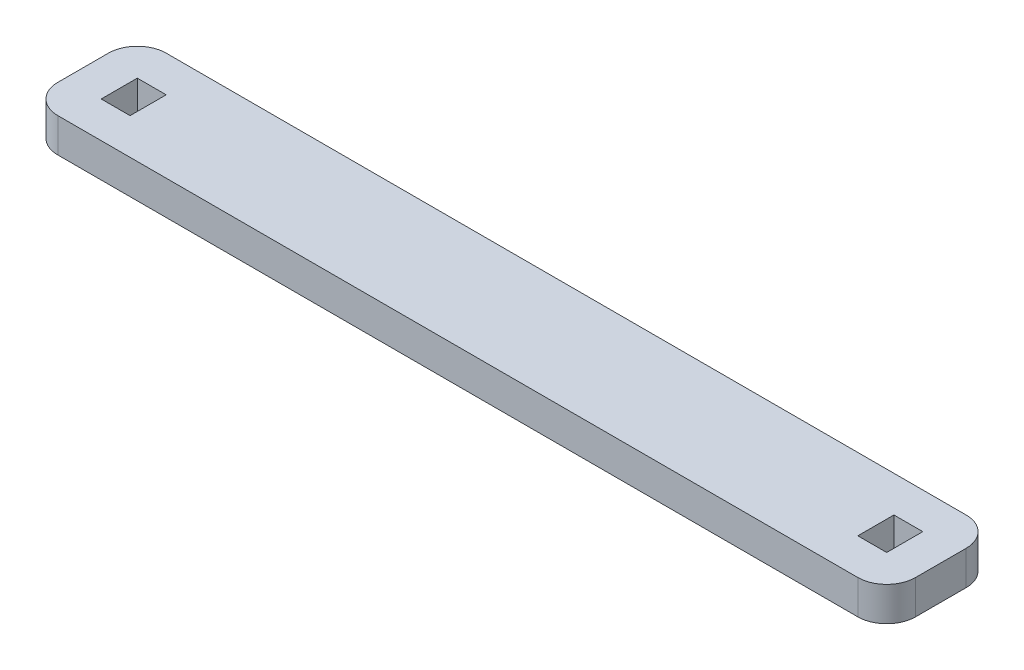
ISO-10303-21;
HEADER;
FILE_DESCRIPTION(('STEP AP214'),'2;1');
FILE_NAME('part.step','',(''),(''),'','','');
FILE_SCHEMA(('AUTOMOTIVE_DESIGN { 1 0 10303 214 1 1 1 1 }'));
ENDSEC;
DATA;
#1=APPLICATION_CONTEXT('core data for automotive mechanical design processes');
#2=APPLICATION_PROTOCOL_DEFINITION('international standard','automotive_design',2000,#1);
#3=PRODUCT_CONTEXT('',#1,'mechanical');
#4=PRODUCT('Part','Part','',(#3));
#5=PRODUCT_RELATED_PRODUCT_CATEGORY('part','',(#4));
#6=PRODUCT_DEFINITION_FORMATION('','',#4);
#7=PRODUCT_DEFINITION_CONTEXT('part definition',#1,'design');
#8=PRODUCT_DEFINITION('design','',#6,#7);
#9=PRODUCT_DEFINITION_SHAPE('','',#8);
#10=(LENGTH_UNIT() NAMED_UNIT(*) SI_UNIT(.MILLI.,.METRE.));
#11=(NAMED_UNIT(*) PLANE_ANGLE_UNIT() SI_UNIT($,.RADIAN.));
#12=(NAMED_UNIT(*) SI_UNIT($,.STERADIAN.) SOLID_ANGLE_UNIT());
#13=UNCERTAINTY_MEASURE_WITH_UNIT(LENGTH_MEASURE(1.E-05),#10,'distance_accuracy_value','');
#14=(GEOMETRIC_REPRESENTATION_CONTEXT(3) GLOBAL_UNCERTAINTY_ASSIGNED_CONTEXT((#13)) GLOBAL_UNIT_ASSIGNED_CONTEXT((#10,
#11,#12)) REPRESENTATION_CONTEXT('',''));
#15=CARTESIAN_POINT('',(0.,0.,0.));
#16=DIRECTION('',(0.,0.,1.));
#17=DIRECTION('',(1.,0.,0.));
#18=AXIS2_PLACEMENT_3D('',#15,#16,#17);
#19=CARTESIAN_POINT('',(0.,1.5,0.));
#20=DIRECTION('',(0.,1.,0.));
#21=DIRECTION('',(0.,0.,1.));
#22=AXIS2_PLACEMENT_3D('',#19,#20,#21);
#23=PLANE('',#22);
#24=DIRECTION('',(-1.,0.,0.));
#25=VECTOR('',#24,1.);
#26=CARTESIAN_POINT('',(37.719,1.5,-4.7625));
#27=LINE('',#26,#25);
#28=CARTESIAN_POINT('',(35.179,1.5,-4.7625));
#29=VERTEX_POINT('',#28);
#30=CARTESIAN_POINT('',(-35.179,1.5,-4.7625));
#31=VERTEX_POINT('',#30);
#32=EDGE_CURVE('E268',#29,#31,#27,.T.);
#33=ORIENTED_EDGE('',*,*,#32,.T.);
#34=CARTESIAN_POINT('',(-35.179,1.5,-2.2225));
#35=DIRECTION('',(0.,1.,0.));
#36=DIRECTION('',(0.,0.,1.));
#37=AXIS2_PLACEMENT_3D('',#34,#35,#36);
#38=CIRCLE('',#37,2.54);
#39=CARTESIAN_POINT('',(-37.719,1.5,-2.2225));
#40=VERTEX_POINT('',#39);
#41=EDGE_CURVE('E319',#31,#40,#38,.T.);
#42=ORIENTED_EDGE('',*,*,#41,.T.);
#43=DIRECTION('',(0.,0.,1.));
#44=VECTOR('',#43,1.);
#45=CARTESIAN_POINT('',(-37.719,1.5,4.7625));
#46=LINE('',#45,#44);
#47=CARTESIAN_POINT('',(-37.719,1.5,2.2225));
#48=VERTEX_POINT('',#47);
#49=EDGE_CURVE('E257',#40,#48,#46,.T.);
#50=ORIENTED_EDGE('',*,*,#49,.T.);
#51=CARTESIAN_POINT('',(-35.179,1.5,2.2225));
#52=DIRECTION('',(0.,1.,0.));
#53=DIRECTION('',(0.,0.,1.));
#54=AXIS2_PLACEMENT_3D('',#51,#52,#53);
#55=CIRCLE('',#54,2.54);
#56=CARTESIAN_POINT('',(-35.179,1.5,4.7625));
#57=VERTEX_POINT('',#56);
#58=EDGE_CURVE('E311',#48,#57,#55,.T.);
#59=ORIENTED_EDGE('',*,*,#58,.T.);
#60=DIRECTION('',(1.,0.,0.));
#61=VECTOR('',#60,1.);
#62=CARTESIAN_POINT('',(37.719,1.5,4.7625));
#63=LINE('',#62,#61);
#64=CARTESIAN_POINT('',(35.179,1.5,4.7625));
#65=VERTEX_POINT('',#64);
#66=EDGE_CURVE('E261',#57,#65,#63,.T.);
#67=ORIENTED_EDGE('',*,*,#66,.T.);
#68=CARTESIAN_POINT('',(35.179,1.5,2.2225));
#69=DIRECTION('',(0.,1.,0.));
#70=DIRECTION('',(0.,0.,1.));
#71=AXIS2_PLACEMENT_3D('',#68,#69,#70);
#72=CIRCLE('',#71,2.54);
#73=CARTESIAN_POINT('',(37.719,1.5,2.2225));
#74=VERTEX_POINT('',#73);
#75=EDGE_CURVE('E68',#65,#74,#72,.T.);
#76=ORIENTED_EDGE('',*,*,#75,.T.);
#77=DIRECTION('',(0.,0.,-1.));
#78=VECTOR('',#77,1.);
#79=CARTESIAN_POINT('',(37.719,1.5,4.7625));
#80=LINE('',#79,#78);
#81=CARTESIAN_POINT('',(37.719,1.5,-2.2225));
#82=VERTEX_POINT('',#81);
#83=EDGE_CURVE('E265',#74,#82,#80,.T.);
#84=ORIENTED_EDGE('',*,*,#83,.T.);
#85=CARTESIAN_POINT('',(35.179,1.5,-2.2225));
#86=DIRECTION('',(0.,1.,0.));
#87=DIRECTION('',(0.,0.,1.));
#88=AXIS2_PLACEMENT_3D('',#85,#86,#87);
#89=CIRCLE('',#88,2.54);
#90=EDGE_CURVE('E316',#82,#29,#89,.T.);
#91=ORIENTED_EDGE('',*,*,#90,.T.);
#92=EDGE_LOOP('',(#33,#42,#50,#59,#67,#76,#84,#91));
#93=FACE_BOUND('',#92,.T.);
#94=DIRECTION('',(1.,0.,0.));
#95=VECTOR('',#94,1.);
#96=CARTESIAN_POINT('',(-32.004,1.5,1.5875));
#97=LINE('',#96,#95);
#98=CARTESIAN_POINT('',(-34.544,1.5,1.5875));
#99=VERTEX_POINT('',#98);
#100=CARTESIAN_POINT('',(-32.004,1.5,1.5875));
#101=VERTEX_POINT('',#100);
#102=EDGE_CURVE('E217',#99,#101,#97,.T.);
#103=ORIENTED_EDGE('',*,*,#102,.F.);
#104=DIRECTION('',(0.,0.,1.));
#105=VECTOR('',#104,1.);
#106=CARTESIAN_POINT('',(-34.544,1.5,1.5875));
#107=LINE('',#106,#105);
#108=CARTESIAN_POINT('',(-34.544,1.5,-1.5875));
#109=VERTEX_POINT('',#108);
#110=EDGE_CURVE('E214',#109,#99,#107,.T.);
#111=ORIENTED_EDGE('',*,*,#110,.F.);
#112=DIRECTION('',(-1.,0.,0.));
#113=VECTOR('',#112,1.);
#114=CARTESIAN_POINT('',(-32.004,1.5,-1.5875));
#115=LINE('',#114,#113);
#116=CARTESIAN_POINT('',(-32.004,1.5,-1.5875));
#117=VERTEX_POINT('',#116);
#118=EDGE_CURVE('E225',#117,#109,#115,.T.);
#119=ORIENTED_EDGE('',*,*,#118,.F.);
#120=DIRECTION('',(0.,0.,-1.));
#121=VECTOR('',#120,1.);
#122=CARTESIAN_POINT('',(-32.004,1.5,1.5875));
#123=LINE('',#122,#121);
#124=EDGE_CURVE('E221',#101,#117,#123,.T.);
#125=ORIENTED_EDGE('',*,*,#124,.F.);
#126=EDGE_LOOP('',(#103,#111,#119,#125));
#127=FACE_BOUND('',#126,.T.);
#128=DIRECTION('',(1.,0.,0.));
#129=VECTOR('',#128,1.);
#130=CARTESIAN_POINT('',(34.544,1.5,1.5875));
#131=LINE('',#130,#129);
#132=CARTESIAN_POINT('',(32.004,1.5,1.5875));
#133=VERTEX_POINT('',#132);
#134=CARTESIAN_POINT('',(34.544,1.5,1.5875));
#135=VERTEX_POINT('',#134);
#136=EDGE_CURVE('E172',#133,#135,#131,.T.);
#137=ORIENTED_EDGE('',*,*,#136,.F.);
#138=DIRECTION('',(0.,0.,1.));
#139=VECTOR('',#138,1.);
#140=CARTESIAN_POINT('',(32.004,1.5,1.5875));
#141=LINE('',#140,#139);
#142=CARTESIAN_POINT('',(32.004,1.5,-1.5875));
#143=VERTEX_POINT('',#142);
#144=EDGE_CURVE('E161',#143,#133,#141,.T.);
#145=ORIENTED_EDGE('',*,*,#144,.F.);
#146=DIRECTION('',(-1.,0.,0.));
#147=VECTOR('',#146,1.);
#148=CARTESIAN_POINT('',(34.544,1.5,-1.5875));
#149=LINE('',#148,#147);
#150=CARTESIAN_POINT('',(34.544,1.5,-1.5875));
#151=VERTEX_POINT('',#150);
#152=EDGE_CURVE('E190',#151,#143,#149,.T.);
#153=ORIENTED_EDGE('',*,*,#152,.F.);
#154=DIRECTION('',(0.,0.,-1.));
#155=VECTOR('',#154,1.);
#156=CARTESIAN_POINT('',(34.544,1.5,1.5875));
#157=LINE('',#156,#155);
#158=EDGE_CURVE('E186',#135,#151,#157,.T.);
#159=ORIENTED_EDGE('',*,*,#158,.F.);
#160=EDGE_LOOP('',(#137,#145,#153,#159));
#161=FACE_BOUND('',#160,.T.);
#162=ADVANCED_FACE('F45',(#93,#127,#161),#23,.T.);
#163=CARTESIAN_POINT('',(0.,-1.5,0.));
#164=DIRECTION('',(0.,1.,0.));
#165=DIRECTION('',(0.,0.,1.));
#166=AXIS2_PLACEMENT_3D('',#163,#164,#165);
#167=PLANE('',#166);
#168=DIRECTION('',(0.,0.,1.));
#169=VECTOR('',#168,1.);
#170=CARTESIAN_POINT('',(-34.544,-1.5,1.5875));
#171=LINE('',#170,#169);
#172=CARTESIAN_POINT('',(-34.544,-1.5,-1.5875));
#173=VERTEX_POINT('',#172);
#174=CARTESIAN_POINT('',(-34.544,-1.5,1.5875));
#175=VERTEX_POINT('',#174);
#176=EDGE_CURVE('E181',#173,#175,#171,.T.);
#177=ORIENTED_EDGE('',*,*,#176,.T.);
#178=DIRECTION('',(1.,0.,0.));
#179=VECTOR('',#178,1.);
#180=CARTESIAN_POINT('',(-32.004,-1.5,1.5875));
#181=LINE('',#180,#179);
#182=CARTESIAN_POINT('',(-32.004,-1.5,1.5875));
#183=VERTEX_POINT('',#182);
#184=EDGE_CURVE('E232',#175,#183,#181,.T.);
#185=ORIENTED_EDGE('',*,*,#184,.T.);
#186=DIRECTION('',(0.,0.,-1.));
#187=VECTOR('',#186,1.);
#188=CARTESIAN_POINT('',(-32.004,-1.5,1.5875));
#189=LINE('',#188,#187);
#190=CARTESIAN_POINT('',(-32.004,-1.5,-1.5875));
#191=VERTEX_POINT('',#190);
#192=EDGE_CURVE('E236',#183,#191,#189,.T.);
#193=ORIENTED_EDGE('',*,*,#192,.T.);
#194=DIRECTION('',(-1.,0.,0.));
#195=VECTOR('',#194,1.);
#196=CARTESIAN_POINT('',(-32.004,-1.5,-1.5875));
#197=LINE('',#196,#195);
#198=EDGE_CURVE('E218',#191,#173,#197,.T.);
#199=ORIENTED_EDGE('',*,*,#198,.T.);
#200=EDGE_LOOP('',(#177,#185,#193,#199));
#201=FACE_BOUND('',#200,.T.);
#202=DIRECTION('',(0.,0.,1.));
#203=VECTOR('',#202,1.);
#204=CARTESIAN_POINT('',(-37.719,-1.5,4.7625));
#205=LINE('',#204,#203);
#206=CARTESIAN_POINT('',(-37.719,-1.5,-2.2225));
#207=VERTEX_POINT('',#206);
#208=CARTESIAN_POINT('',(-37.719,-1.5,2.2225));
#209=VERTEX_POINT('',#208);
#210=EDGE_CURVE('E256',#207,#209,#205,.T.);
#211=ORIENTED_EDGE('',*,*,#210,.F.);
#212=CARTESIAN_POINT('',(-35.179,-1.5,-2.2225));
#213=DIRECTION('',(0.,1.,0.));
#214=DIRECTION('',(0.,0.,1.));
#215=AXIS2_PLACEMENT_3D('',#212,#213,#214);
#216=CIRCLE('',#215,2.54);
#217=CARTESIAN_POINT('',(-35.179,-1.5,-4.7625));
#218=VERTEX_POINT('',#217);
#219=EDGE_CURVE('E301',#207,#218,#216,.F.);
#220=ORIENTED_EDGE('',*,*,#219,.T.);
#221=DIRECTION('',(-1.,0.,0.));
#222=VECTOR('',#221,1.);
#223=CARTESIAN_POINT('',(37.719,-1.5,-4.7625));
#224=LINE('',#223,#222);
#225=CARTESIAN_POINT('',(35.179,-1.5,-4.7625));
#226=VERTEX_POINT('',#225);
#227=EDGE_CURVE('E262',#226,#218,#224,.T.);
#228=ORIENTED_EDGE('',*,*,#227,.F.);
#229=CARTESIAN_POINT('',(35.179,-1.5,-2.2225));
#230=DIRECTION('',(0.,1.,0.));
#231=DIRECTION('',(0.,0.,1.));
#232=AXIS2_PLACEMENT_3D('',#229,#230,#231);
#233=CIRCLE('',#232,2.54);
#234=CARTESIAN_POINT('',(37.719,-1.5,-2.2225));
#235=VERTEX_POINT('',#234);
#236=EDGE_CURVE('E298',#226,#235,#233,.F.);
#237=ORIENTED_EDGE('',*,*,#236,.T.);
#238=DIRECTION('',(0.,0.,-1.));
#239=VECTOR('',#238,1.);
#240=CARTESIAN_POINT('',(37.719,-1.5,4.7625));
#241=LINE('',#240,#239);
#242=CARTESIAN_POINT('',(37.719,-1.5,2.2225));
#243=VERTEX_POINT('',#242);
#244=EDGE_CURVE('E280',#243,#235,#241,.T.);
#245=ORIENTED_EDGE('',*,*,#244,.F.);
#246=CARTESIAN_POINT('',(35.179,-1.5,2.2225));
#247=DIRECTION('',(0.,1.,0.));
#248=DIRECTION('',(0.,0.,1.));
#249=AXIS2_PLACEMENT_3D('',#246,#247,#248);
#250=CIRCLE('',#249,2.54);
#251=CARTESIAN_POINT('',(35.179,-1.5,4.7625));
#252=VERTEX_POINT('',#251);
#253=EDGE_CURVE('E295',#243,#252,#250,.F.);
#254=ORIENTED_EDGE('',*,*,#253,.T.);
#255=DIRECTION('',(1.,0.,0.));
#256=VECTOR('',#255,1.);
#257=CARTESIAN_POINT('',(37.719,-1.5,4.7625));
#258=LINE('',#257,#256);
#259=CARTESIAN_POINT('',(-35.179,-1.5,4.7625));
#260=VERTEX_POINT('',#259);
#261=EDGE_CURVE('E276',#260,#252,#258,.T.);
#262=ORIENTED_EDGE('',*,*,#261,.F.);
#263=CARTESIAN_POINT('',(-35.179,-1.5,2.2225));
#264=DIRECTION('',(0.,1.,0.));
#265=DIRECTION('',(0.,0.,1.));
#266=AXIS2_PLACEMENT_3D('',#263,#264,#265);
#267=CIRCLE('',#266,2.54);
#268=EDGE_CURVE('E292',#260,#209,#267,.F.);
#269=ORIENTED_EDGE('',*,*,#268,.T.);
#270=EDGE_LOOP('',(#211,#220,#228,#237,#245,#254,#262,#269));
#271=FACE_BOUND('',#270,.T.);
#272=DIRECTION('',(0.,0.,1.));
#273=VECTOR('',#272,1.);
#274=CARTESIAN_POINT('',(32.004,-1.5,1.5875));
#275=LINE('',#274,#273);
#276=CARTESIAN_POINT('',(32.004,-1.5,-1.5875));
#277=VERTEX_POINT('',#276);
#278=CARTESIAN_POINT('',(32.004,-1.5,1.5875));
#279=VERTEX_POINT('',#278);
#280=EDGE_CURVE('E195',#277,#279,#275,.T.);
#281=ORIENTED_EDGE('',*,*,#280,.T.);
#282=DIRECTION('',(1.,0.,0.));
#283=VECTOR('',#282,1.);
#284=CARTESIAN_POINT('',(34.544,-1.5,1.5875));
#285=LINE('',#284,#283);
#286=CARTESIAN_POINT('',(34.544,-1.5,1.5875));
#287=VERTEX_POINT('',#286);
#288=EDGE_CURVE('E179',#279,#287,#285,.T.);
#289=ORIENTED_EDGE('',*,*,#288,.T.);
#290=DIRECTION('',(0.,0.,-1.));
#291=VECTOR('',#290,1.);
#292=CARTESIAN_POINT('',(34.544,-1.5,1.5875));
#293=LINE('',#292,#291);
#294=CARTESIAN_POINT('',(34.544,-1.5,-1.5875));
#295=VERTEX_POINT('',#294);
#296=EDGE_CURVE('E200',#287,#295,#293,.T.);
#297=ORIENTED_EDGE('',*,*,#296,.T.);
#298=DIRECTION('',(-1.,0.,0.));
#299=VECTOR('',#298,1.);
#300=CARTESIAN_POINT('',(34.544,-1.5,-1.5875));
#301=LINE('',#300,#299);
#302=EDGE_CURVE('E173',#295,#277,#301,.T.);
#303=ORIENTED_EDGE('',*,*,#302,.T.);
#304=EDGE_LOOP('',(#281,#289,#297,#303));
#305=FACE_BOUND('',#304,.T.);
#306=ADVANCED_FACE('F339',(#201,#271,#305),#167,.F.);
#307=CARTESIAN_POINT('',(-37.719,1.5,4.7625));
#308=DIRECTION('',(1.,0.,0.));
#309=DIRECTION('',(0.,0.,-1.));
#310=AXIS2_PLACEMENT_3D('',#307,#308,#309);
#311=PLANE('',#310);
#312=ORIENTED_EDGE('',*,*,#49,.F.);
#313=DIRECTION('',(0.,-1.,0.));
#314=VECTOR('',#313,1.);
#315=CARTESIAN_POINT('',(-37.719,1.5,-2.2225));
#316=LINE('',#315,#314);
#317=EDGE_CURVE('E288',#40,#207,#316,.T.);
#318=ORIENTED_EDGE('',*,*,#317,.T.);
#319=ORIENTED_EDGE('',*,*,#210,.T.);
#320=DIRECTION('',(0.,-1.,0.));
#321=VECTOR('',#320,1.);
#322=CARTESIAN_POINT('',(-37.719,1.5,2.2225));
#323=LINE('',#322,#321);
#324=EDGE_CURVE('E272',#209,#48,#323,.F.);
#325=ORIENTED_EDGE('',*,*,#324,.T.);
#326=EDGE_LOOP('',(#312,#318,#319,#325));
#327=FACE_BOUND('',#326,.T.);
#328=ADVANCED_FACE('F362',(#327),#311,.F.);
#329=CARTESIAN_POINT('',(37.719,1.5,4.7625));
#330=DIRECTION('',(0.,0.,-1.));
#331=DIRECTION('',(-1.,0.,0.));
#332=AXIS2_PLACEMENT_3D('',#329,#330,#331);
#333=PLANE('',#332);
#334=ORIENTED_EDGE('',*,*,#261,.T.);
#335=DIRECTION('',(0.,-1.,0.));
#336=VECTOR('',#335,1.);
#337=CARTESIAN_POINT('',(35.179,1.5,4.7625));
#338=LINE('',#337,#336);
#339=EDGE_CURVE('E11',#252,#65,#338,.F.);
#340=ORIENTED_EDGE('',*,*,#339,.T.);
#341=ORIENTED_EDGE('',*,*,#66,.F.);
#342=DIRECTION('',(0.,-1.,0.));
#343=VECTOR('',#342,1.);
#344=CARTESIAN_POINT('',(-35.179,1.5,4.7625));
#345=LINE('',#344,#343);
#346=EDGE_CURVE('E54',#57,#260,#345,.T.);
#347=ORIENTED_EDGE('',*,*,#346,.T.);
#348=EDGE_LOOP('',(#334,#340,#341,#347));
#349=FACE_BOUND('',#348,.T.);
#350=ADVANCED_FACE('F333',(#349),#333,.F.);
#351=CARTESIAN_POINT('',(37.719,1.5,4.7625));
#352=DIRECTION('',(-1.,0.,0.));
#353=DIRECTION('',(0.,0.,1.));
#354=AXIS2_PLACEMENT_3D('',#351,#352,#353);
#355=PLANE('',#354);
#356=ORIENTED_EDGE('',*,*,#244,.T.);
#357=DIRECTION('',(0.,-1.,0.));
#358=VECTOR('',#357,1.);
#359=CARTESIAN_POINT('',(37.719,1.5,-2.2225));
#360=LINE('',#359,#358);
#361=EDGE_CURVE('E61',#235,#82,#360,.F.);
#362=ORIENTED_EDGE('',*,*,#361,.T.);
#363=ORIENTED_EDGE('',*,*,#83,.F.);
#364=DIRECTION('',(0.,-1.,0.));
#365=VECTOR('',#364,1.);
#366=CARTESIAN_POINT('',(37.719,1.5,2.2225));
#367=LINE('',#366,#365);
#368=EDGE_CURVE('E322',#74,#243,#367,.T.);
#369=ORIENTED_EDGE('',*,*,#368,.T.);
#370=EDGE_LOOP('',(#356,#362,#363,#369));
#371=FACE_BOUND('',#370,.T.);
#372=ADVANCED_FACE('F345',(#371),#355,.F.);
#373=CARTESIAN_POINT('',(37.719,1.5,-4.7625));
#374=DIRECTION('',(0.,0.,1.));
#375=DIRECTION('',(1.,0.,0.));
#376=AXIS2_PLACEMENT_3D('',#373,#374,#375);
#377=PLANE('',#376);
#378=ORIENTED_EDGE('',*,*,#227,.T.);
#379=DIRECTION('',(0.,-1.,0.));
#380=VECTOR('',#379,1.);
#381=CARTESIAN_POINT('',(-35.179,1.5,-4.7625));
#382=LINE('',#381,#380);
#383=EDGE_CURVE('E308',#218,#31,#382,.F.);
#384=ORIENTED_EDGE('',*,*,#383,.T.);
#385=ORIENTED_EDGE('',*,*,#32,.F.);
#386=DIRECTION('',(0.,-1.,0.));
#387=VECTOR('',#386,1.);
#388=CARTESIAN_POINT('',(35.179,1.5,-4.7625));
#389=LINE('',#388,#387);
#390=EDGE_CURVE('E304',#29,#226,#389,.T.);
#391=ORIENTED_EDGE('',*,*,#390,.T.);
#392=EDGE_LOOP('',(#378,#384,#385,#391));
#393=FACE_BOUND('',#392,.T.);
#394=ADVANCED_FACE('F354',(#393),#377,.F.);
#395=CARTESIAN_POINT('',(-34.544,1.5,1.5875));
#396=DIRECTION('',(1.,0.,0.));
#397=DIRECTION('',(0.,0.,-1.));
#398=AXIS2_PLACEMENT_3D('',#395,#396,#397);
#399=PLANE('',#398);
#400=ORIENTED_EDGE('',*,*,#176,.F.);
#401=DIRECTION('',(0.,-1.,0.));
#402=VECTOR('',#401,1.);
#403=CARTESIAN_POINT('',(-34.544,1.5,-1.5875));
#404=LINE('',#403,#402);
#405=EDGE_CURVE('E228',#109,#173,#404,.T.);
#406=ORIENTED_EDGE('',*,*,#405,.F.);
#407=ORIENTED_EDGE('',*,*,#110,.T.);
#408=DIRECTION('',(0.,-1.,0.));
#409=VECTOR('',#408,1.);
#410=CARTESIAN_POINT('',(-34.544,1.5,1.5875));
#411=LINE('',#410,#409);
#412=EDGE_CURVE('E252',#99,#175,#411,.T.);
#413=ORIENTED_EDGE('',*,*,#412,.T.);
#414=EDGE_LOOP('',(#400,#406,#407,#413));
#415=FACE_BOUND('',#414,.T.);
#416=ADVANCED_FACE('F377',(#415),#399,.T.);
#417=CARTESIAN_POINT('',(-32.004,1.5,1.5875));
#418=DIRECTION('',(0.,0.,-1.));
#419=DIRECTION('',(-1.,0.,0.));
#420=AXIS2_PLACEMENT_3D('',#417,#418,#419);
#421=PLANE('',#420);
#422=ORIENTED_EDGE('',*,*,#184,.F.);
#423=ORIENTED_EDGE('',*,*,#412,.F.);
#424=ORIENTED_EDGE('',*,*,#102,.T.);
#425=DIRECTION('',(0.,-1.,0.));
#426=VECTOR('',#425,1.);
#427=CARTESIAN_POINT('',(-32.004,1.5,1.5875));
#428=LINE('',#427,#426);
#429=EDGE_CURVE('E249',#101,#183,#428,.T.);
#430=ORIENTED_EDGE('',*,*,#429,.T.);
#431=EDGE_LOOP('',(#422,#423,#424,#430));
#432=FACE_BOUND('',#431,.T.);
#433=ADVANCED_FACE('F459',(#432),#421,.T.);
#434=CARTESIAN_POINT('',(-32.004,1.5,1.5875));
#435=DIRECTION('',(-1.,0.,0.));
#436=DIRECTION('',(0.,0.,1.));
#437=AXIS2_PLACEMENT_3D('',#434,#435,#436);
#438=PLANE('',#437);
#439=ORIENTED_EDGE('',*,*,#192,.F.);
#440=ORIENTED_EDGE('',*,*,#429,.F.);
#441=ORIENTED_EDGE('',*,*,#124,.T.);
#442=DIRECTION('',(0.,-1.,0.));
#443=VECTOR('',#442,1.);
#444=CARTESIAN_POINT('',(-32.004,1.5,-1.5875));
#445=LINE('',#444,#443);
#446=EDGE_CURVE('E246',#117,#191,#445,.T.);
#447=ORIENTED_EDGE('',*,*,#446,.T.);
#448=EDGE_LOOP('',(#439,#440,#441,#447));
#449=FACE_BOUND('',#448,.T.);
#450=ADVANCED_FACE('F450',(#449),#438,.T.);
#451=CARTESIAN_POINT('',(-32.004,1.5,-1.5875));
#452=DIRECTION('',(0.,0.,1.));
#453=DIRECTION('',(1.,0.,0.));
#454=AXIS2_PLACEMENT_3D('',#451,#452,#453);
#455=PLANE('',#454);
#456=ORIENTED_EDGE('',*,*,#198,.F.);
#457=ORIENTED_EDGE('',*,*,#446,.F.);
#458=ORIENTED_EDGE('',*,*,#118,.T.);
#459=ORIENTED_EDGE('',*,*,#405,.T.);
#460=EDGE_LOOP('',(#456,#457,#458,#459));
#461=FACE_BOUND('',#460,.T.);
#462=ADVANCED_FACE('F442',(#461),#455,.T.);
#463=CARTESIAN_POINT('',(32.004,1.5,1.5875));
#464=DIRECTION('',(1.,0.,0.));
#465=DIRECTION('',(0.,0.,-1.));
#466=AXIS2_PLACEMENT_3D('',#463,#464,#465);
#467=PLANE('',#466);
#468=ORIENTED_EDGE('',*,*,#280,.F.);
#469=DIRECTION('',(0.,-1.,0.));
#470=VECTOR('',#469,1.);
#471=CARTESIAN_POINT('',(32.004,1.5,-1.5875));
#472=LINE('',#471,#470);
#473=EDGE_CURVE('E167',#143,#277,#472,.T.);
#474=ORIENTED_EDGE('',*,*,#473,.F.);
#475=ORIENTED_EDGE('',*,*,#144,.T.);
#476=DIRECTION('',(0.,-1.,0.));
#477=VECTOR('',#476,1.);
#478=CARTESIAN_POINT('',(32.004,1.5,1.5875));
#479=LINE('',#478,#477);
#480=EDGE_CURVE('E164',#133,#279,#479,.T.);
#481=ORIENTED_EDGE('',*,*,#480,.T.);
#482=EDGE_LOOP('',(#468,#474,#475,#481));
#483=FACE_BOUND('',#482,.T.);
#484=ADVANCED_FACE('F163',(#483),#467,.T.);
#485=CARTESIAN_POINT('',(34.544,1.5,1.5875));
#486=DIRECTION('',(0.,0.,-1.));
#487=DIRECTION('',(-1.,0.,0.));
#488=AXIS2_PLACEMENT_3D('',#485,#486,#487);
#489=PLANE('',#488);
#490=ORIENTED_EDGE('',*,*,#288,.F.);
#491=ORIENTED_EDGE('',*,*,#480,.F.);
#492=ORIENTED_EDGE('',*,*,#136,.T.);
#493=DIRECTION('',(0.,-1.,0.));
#494=VECTOR('',#493,1.);
#495=CARTESIAN_POINT('',(34.544,1.5,1.5875));
#496=LINE('',#495,#494);
#497=EDGE_CURVE('E182',#135,#287,#496,.T.);
#498=ORIENTED_EDGE('',*,*,#497,.T.);
#499=EDGE_LOOP('',(#490,#491,#492,#498));
#500=FACE_BOUND('',#499,.T.);
#501=ADVANCED_FACE('F176',(#500),#489,.T.);
#502=CARTESIAN_POINT('',(34.544,1.5,1.5875));
#503=DIRECTION('',(-1.,0.,0.));
#504=DIRECTION('',(0.,0.,1.));
#505=AXIS2_PLACEMENT_3D('',#502,#503,#504);
#506=PLANE('',#505);
#507=ORIENTED_EDGE('',*,*,#296,.F.);
#508=ORIENTED_EDGE('',*,*,#497,.F.);
#509=ORIENTED_EDGE('',*,*,#158,.T.);
#510=DIRECTION('',(0.,-1.,0.));
#511=VECTOR('',#510,1.);
#512=CARTESIAN_POINT('',(34.544,1.5,-1.5875));
#513=LINE('',#512,#511);
#514=EDGE_CURVE('E209',#151,#295,#513,.T.);
#515=ORIENTED_EDGE('',*,*,#514,.T.);
#516=EDGE_LOOP('',(#507,#508,#509,#515));
#517=FACE_BOUND('',#516,.T.);
#518=ADVANCED_FACE('F418',(#517),#506,.T.);
#519=CARTESIAN_POINT('',(34.544,1.5,-1.5875));
#520=DIRECTION('',(0.,0.,1.));
#521=DIRECTION('',(1.,0.,0.));
#522=AXIS2_PLACEMENT_3D('',#519,#520,#521);
#523=PLANE('',#522);
#524=ORIENTED_EDGE('',*,*,#302,.F.);
#525=ORIENTED_EDGE('',*,*,#514,.F.);
#526=ORIENTED_EDGE('',*,*,#152,.T.);
#527=ORIENTED_EDGE('',*,*,#473,.T.);
#528=EDGE_LOOP('',(#524,#525,#526,#527));
#529=FACE_BOUND('',#528,.T.);
#530=ADVANCED_FACE('F390',(#529),#523,.T.);
#531=CARTESIAN_POINT('',(-35.179,1.5,-2.2225));
#532=DIRECTION('',(0.,-1.,0.));
#533=DIRECTION('',(0.,0.,-1.));
#534=AXIS2_PLACEMENT_3D('',#531,#532,#533);
#535=CYLINDRICAL_SURFACE('',#534,2.54);
#536=ORIENTED_EDGE('',*,*,#41,.F.);
#537=ORIENTED_EDGE('',*,*,#383,.F.);
#538=ORIENTED_EDGE('',*,*,#219,.F.);
#539=ORIENTED_EDGE('',*,*,#317,.F.);
#540=EDGE_LOOP('',(#536,#537,#538,#539));
#541=FACE_BOUND('',#540,.T.);
#542=ADVANCED_FACE('F359',(#541),#535,.T.);
#543=CARTESIAN_POINT('',(35.179,1.5,-2.2225));
#544=DIRECTION('',(0.,-1.,0.));
#545=DIRECTION('',(0.,0.,-1.));
#546=AXIS2_PLACEMENT_3D('',#543,#544,#545);
#547=CYLINDRICAL_SURFACE('',#546,2.54);
#548=ORIENTED_EDGE('',*,*,#90,.F.);
#549=ORIENTED_EDGE('',*,*,#361,.F.);
#550=ORIENTED_EDGE('',*,*,#236,.F.);
#551=ORIENTED_EDGE('',*,*,#390,.F.);
#552=EDGE_LOOP('',(#548,#549,#550,#551));
#553=FACE_BOUND('',#552,.T.);
#554=ADVANCED_FACE('F351',(#553),#547,.T.);
#555=CARTESIAN_POINT('',(35.179,1.5,2.2225));
#556=DIRECTION('',(0.,-1.,0.));
#557=DIRECTION('',(0.,0.,-1.));
#558=AXIS2_PLACEMENT_3D('',#555,#556,#557);
#559=CYLINDRICAL_SURFACE('',#558,2.54);
#560=ORIENTED_EDGE('',*,*,#75,.F.);
#561=ORIENTED_EDGE('',*,*,#339,.F.);
#562=ORIENTED_EDGE('',*,*,#253,.F.);
#563=ORIENTED_EDGE('',*,*,#368,.F.);
#564=EDGE_LOOP('',(#560,#561,#562,#563));
#565=FACE_BOUND('',#564,.T.);
#566=ADVANCED_FACE('F344',(#565),#559,.T.);
#567=CARTESIAN_POINT('',(-35.179,1.5,2.2225));
#568=DIRECTION('',(0.,-1.,0.));
#569=DIRECTION('',(0.,0.,-1.));
#570=AXIS2_PLACEMENT_3D('',#567,#568,#569);
#571=CYLINDRICAL_SURFACE('',#570,2.54);
#572=ORIENTED_EDGE('',*,*,#58,.F.);
#573=ORIENTED_EDGE('',*,*,#324,.F.);
#574=ORIENTED_EDGE('',*,*,#268,.F.);
#575=ORIENTED_EDGE('',*,*,#346,.F.);
#576=EDGE_LOOP('',(#572,#573,#574,#575));
#577=FACE_BOUND('',#576,.T.);
#578=ADVANCED_FACE('F47',(#577),#571,.T.);
#579=CLOSED_SHELL('',(#162,#306,#328,#350,#372,#394,#416,#433,#450,#462,#484,#501,#518,#530,
#542,#554,#566,#578));
#580=MANIFOLD_SOLID_BREP('B2',#579);
#581=ADVANCED_BREP_SHAPE_REPRESENTATION('',(#18,#580),#14);
#582=SHAPE_DEFINITION_REPRESENTATION(#9,#581);
ENDSEC;
END-ISO-10303-21;
